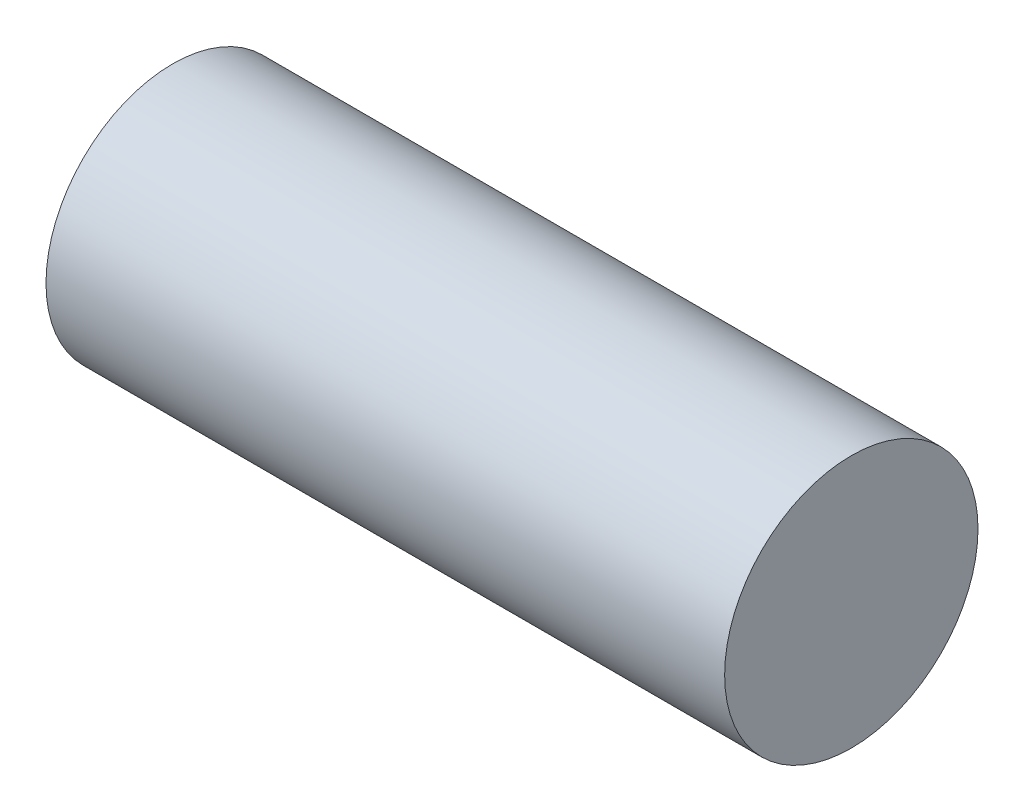
ISO-10303-21;
HEADER;
FILE_DESCRIPTION(('STEP AP214'),'2;1');
FILE_NAME('part.step','',(''),(''),'','','');
FILE_SCHEMA(('AUTOMOTIVE_DESIGN { 1 0 10303 214 1 1 1 1 }'));
ENDSEC;
DATA;
#1=APPLICATION_CONTEXT('core data for automotive mechanical design processes');
#2=APPLICATION_PROTOCOL_DEFINITION('international standard','automotive_design',2000,#1);
#3=PRODUCT_CONTEXT('',#1,'mechanical');
#4=PRODUCT('Part','Part','',(#3));
#5=PRODUCT_RELATED_PRODUCT_CATEGORY('part','',(#4));
#6=PRODUCT_DEFINITION_FORMATION('','',#4);
#7=PRODUCT_DEFINITION_CONTEXT('part definition',#1,'design');
#8=PRODUCT_DEFINITION('design','',#6,#7);
#9=PRODUCT_DEFINITION_SHAPE('','',#8);
#10=(LENGTH_UNIT() NAMED_UNIT(*) SI_UNIT(.MILLI.,.METRE.));
#11=(NAMED_UNIT(*) PLANE_ANGLE_UNIT() SI_UNIT($,.RADIAN.));
#12=(NAMED_UNIT(*) SI_UNIT($,.STERADIAN.) SOLID_ANGLE_UNIT());
#13=UNCERTAINTY_MEASURE_WITH_UNIT(LENGTH_MEASURE(1.E-05),#10,'distance_accuracy_value','');
#14=(GEOMETRIC_REPRESENTATION_CONTEXT(3) GLOBAL_UNCERTAINTY_ASSIGNED_CONTEXT((#13)) GLOBAL_UNIT_ASSIGNED_CONTEXT((#10,
#11,#12)) REPRESENTATION_CONTEXT('',''));
#15=CARTESIAN_POINT('',(0.,0.,0.));
#16=DIRECTION('',(0.,0.,1.));
#17=DIRECTION('',(1.,0.,0.));
#18=AXIS2_PLACEMENT_3D('',#15,#16,#17);
#19=CARTESIAN_POINT('',(150.,0.,0.));
#20=DIRECTION('',(-1.,0.,0.));
#21=DIRECTION('',(0.,0.,1.));
#22=AXIS2_PLACEMENT_3D('',#19,#20,#21);
#23=CYLINDRICAL_SURFACE('',#22,28.);
#24=CARTESIAN_POINT('',(150.,0.,0.));
#25=DIRECTION('',(1.,0.,0.));
#26=DIRECTION('',(0.,0.,-1.));
#27=AXIS2_PLACEMENT_3D('',#24,#25,#26);
#28=CIRCLE('',#27,28.);
#29=CARTESIAN_POINT('',(150.,0.,-28.));
#30=VERTEX_POINT('',#29);
#31=EDGE_CURVE('E10',#30,#30,#28,.T.);
#32=ORIENTED_EDGE('',*,*,#31,.F.);
#33=EDGE_LOOP('',(#32));
#34=FACE_BOUND('',#33,.T.);
#35=CARTESIAN_POINT('',(0.,0.,0.));
#36=DIRECTION('',(1.,0.,0.));
#37=DIRECTION('',(0.,0.,-1.));
#38=AXIS2_PLACEMENT_3D('',#35,#36,#37);
#39=CIRCLE('',#38,28.);
#40=CARTESIAN_POINT('',(0.,0.,-28.));
#41=VERTEX_POINT('',#40);
#42=EDGE_CURVE('E44',#41,#41,#39,.T.);
#43=ORIENTED_EDGE('',*,*,#42,.T.);
#44=EDGE_LOOP('',(#43));
#45=FACE_BOUND('',#44,.T.);
#46=ADVANCED_FACE('F41',(#34,#45),#23,.T.);
#47=CARTESIAN_POINT('',(150.,0.,0.));
#48=DIRECTION('',(1.,0.,0.));
#49=DIRECTION('',(0.,0.,-1.));
#50=AXIS2_PLACEMENT_3D('',#47,#48,#49);
#51=PLANE('',#50);
#52=ORIENTED_EDGE('',*,*,#31,.T.);
#53=EDGE_LOOP('',(#52));
#54=FACE_BOUND('',#53,.T.);
#55=ADVANCED_FACE('F56',(#54),#51,.T.);
#56=CARTESIAN_POINT('',(0.,0.,0.));
#57=DIRECTION('',(1.,0.,0.));
#58=DIRECTION('',(0.,0.,-1.));
#59=AXIS2_PLACEMENT_3D('',#56,#57,#58);
#60=PLANE('',#59);
#61=ORIENTED_EDGE('',*,*,#42,.F.);
#62=EDGE_LOOP('',(#61));
#63=FACE_BOUND('',#62,.T.);
#64=ADVANCED_FACE('F54',(#63),#60,.F.);
#65=CLOSED_SHELL('',(#46,#55,#64));
#66=MANIFOLD_SOLID_BREP('B2',#65);
#67=ADVANCED_BREP_SHAPE_REPRESENTATION('',(#18,#66),#14);
#68=SHAPE_DEFINITION_REPRESENTATION(#9,#67);
ENDSEC;
END-ISO-10303-21;
